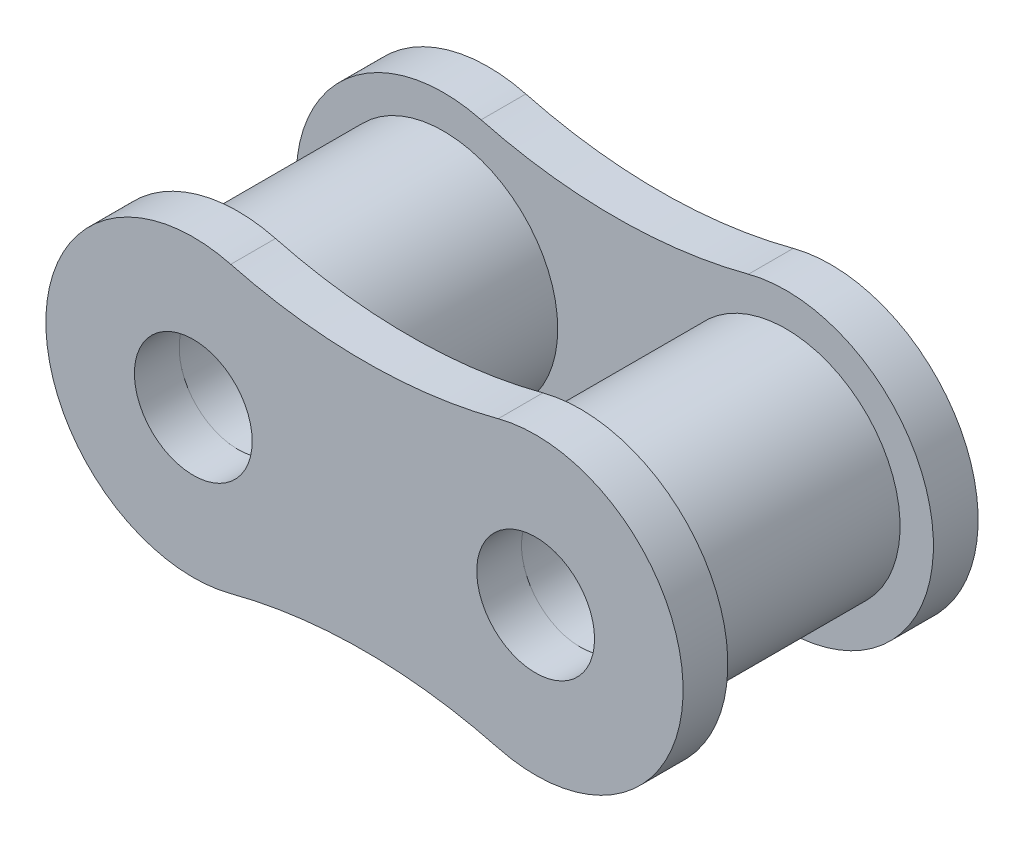
ISO-10303-21;
HEADER;
FILE_DESCRIPTION(('STEP AP214'),'2;1');
FILE_NAME('part.step','',(''),(''),'','','');
FILE_SCHEMA(('AUTOMOTIVE_DESIGN { 1 0 10303 214 1 1 1 1 }'));
ENDSEC;
DATA;
#1=APPLICATION_CONTEXT('core data for automotive mechanical design processes');
#2=APPLICATION_PROTOCOL_DEFINITION('international standard','automotive_design',2000,#1);
#3=PRODUCT_CONTEXT('',#1,'mechanical');
#4=PRODUCT('Part','Part','',(#3));
#5=PRODUCT_RELATED_PRODUCT_CATEGORY('part','',(#4));
#6=PRODUCT_DEFINITION_FORMATION('','',#4);
#7=PRODUCT_DEFINITION_CONTEXT('part definition',#1,'design');
#8=PRODUCT_DEFINITION('design','',#6,#7);
#9=PRODUCT_DEFINITION_SHAPE('','',#8);
#10=(LENGTH_UNIT() NAMED_UNIT(*) SI_UNIT(.MILLI.,.METRE.));
#11=(NAMED_UNIT(*) PLANE_ANGLE_UNIT() SI_UNIT($,.RADIAN.));
#12=(NAMED_UNIT(*) SI_UNIT($,.STERADIAN.) SOLID_ANGLE_UNIT());
#13=UNCERTAINTY_MEASURE_WITH_UNIT(LENGTH_MEASURE(1.E-05),#10,'distance_accuracy_value','');
#14=(GEOMETRIC_REPRESENTATION_CONTEXT(3) GLOBAL_UNCERTAINTY_ASSIGNED_CONTEXT((#13)) GLOBAL_UNIT_ASSIGNED_CONTEXT((#10,
#11,#12)) REPRESENTATION_CONTEXT('',''));
#15=CARTESIAN_POINT('',(0.,0.,0.));
#16=DIRECTION('',(0.,0.,1.));
#17=DIRECTION('',(1.,0.,0.));
#18=AXIS2_PLACEMENT_3D('',#15,#16,#17);
#19=CARTESIAN_POINT('',(2.38125,9.06153502708978,4.1046));
#20=DIRECTION('',(0.,0.,1.));
#21=DIRECTION('',(1.,0.,0.));
#22=AXIS2_PLACEMENT_3D('',#19,#20,#21);
#23=PLANE('',#22);
#24=CARTESIAN_POINT('',(-4.7625,0.,4.1046));
#25=DIRECTION('',(0.,0.,1.));
#26=DIRECTION('',(1.,0.,0.));
#27=AXIS2_PLACEMENT_3D('',#24,#25,#26);
#28=CIRCLE('',#27,1.6383);
#29=CARTESIAN_POINT('',(-3.1242,0.,4.1046));
#30=VERTEX_POINT('',#29);
#31=EDGE_CURVE('E113',#30,#30,#28,.T.);
#32=ORIENTED_EDGE('',*,*,#31,.F.);
#33=EDGE_LOOP('',(#32));
#34=FACE_BOUND('',#33,.T.);
#35=CARTESIAN_POINT('',(0.,18.1230700541796,4.1046));
#36=DIRECTION('',(0.,0.,-1.));
#37=DIRECTION('',(1.,0.,0.));
#38=AXIS2_PLACEMENT_3D('',#35,#36,#37);
#39=CIRCLE('',#38,14.6362850541796);
#40=CARTESIAN_POINT('',(3.71992075992603,3.96739876218244,4.1046));
#41=VERTEX_POINT('',#40);
#42=CARTESIAN_POINT('',(-3.71992075992603,3.96739876218244,4.1046));
#43=VERTEX_POINT('',#42);
#44=EDGE_CURVE('E98',#41,#43,#39,.T.);
#45=ORIENTED_EDGE('',*,*,#44,.T.);
#46=CARTESIAN_POINT('',(-4.7625,0.,4.1046));
#47=DIRECTION('',(0.,0.,1.));
#48=DIRECTION('',(1.,0.,0.));
#49=AXIS2_PLACEMENT_3D('',#46,#47,#48);
#50=CIRCLE('',#49,4.1021);
#51=CARTESIAN_POINT('',(-3.71992075992603,-3.96739876218244,4.1046));
#52=VERTEX_POINT('',#51);
#53=EDGE_CURVE('E93',#43,#52,#50,.T.);
#54=ORIENTED_EDGE('',*,*,#53,.T.);
#55=CARTESIAN_POINT('',(0.,-18.1230700541796,4.1046));
#56=DIRECTION('',(0.,0.,-1.));
#57=DIRECTION('',(1.,0.,0.));
#58=AXIS2_PLACEMENT_3D('',#55,#56,#57);
#59=CIRCLE('',#58,14.6362850541796);
#60=CARTESIAN_POINT('',(3.71992075992603,-3.96739876218244,4.1046));
#61=VERTEX_POINT('',#60);
#62=EDGE_CURVE('E96',#52,#61,#59,.T.);
#63=ORIENTED_EDGE('',*,*,#62,.T.);
#64=CARTESIAN_POINT('',(4.7625,0.,4.1046));
#65=DIRECTION('',(0.,0.,1.));
#66=DIRECTION('',(1.,0.,0.));
#67=AXIS2_PLACEMENT_3D('',#64,#65,#66);
#68=CIRCLE('',#67,4.1021);
#69=EDGE_CURVE('E63',#61,#41,#68,.T.);
#70=ORIENTED_EDGE('',*,*,#69,.T.);
#71=EDGE_LOOP('',(#45,#54,#63,#70));
#72=FACE_BOUND('',#71,.T.);
#73=CARTESIAN_POINT('',(4.7625,0.,4.1046));
#74=DIRECTION('',(0.,0.,1.));
#75=DIRECTION('',(1.,0.,0.));
#76=AXIS2_PLACEMENT_3D('',#73,#74,#75);
#77=CIRCLE('',#76,1.6383);
#78=CARTESIAN_POINT('',(6.4008,0.,4.1046));
#79=VERTEX_POINT('',#78);
#80=EDGE_CURVE('E128',#79,#79,#77,.T.);
#81=ORIENTED_EDGE('',*,*,#80,.F.);
#82=EDGE_LOOP('',(#81));
#83=FACE_BOUND('',#82,.T.);
#84=ADVANCED_FACE('F46',(#34,#72,#83),#23,.T.);
#85=CARTESIAN_POINT('',(2.38125,9.06153502708978,2.86));
#86=DIRECTION('',(0.,0.,1.));
#87=DIRECTION('',(1.,0.,0.));
#88=AXIS2_PLACEMENT_3D('',#85,#86,#87);
#89=PLANE('',#88);
#90=CARTESIAN_POINT('',(0.,18.1230700541796,2.86));
#91=DIRECTION('',(0.,0.,-1.));
#92=DIRECTION('',(1.,0.,0.));
#93=AXIS2_PLACEMENT_3D('',#90,#91,#92);
#94=CIRCLE('',#93,14.6362850541796);
#95=CARTESIAN_POINT('',(3.71992075992603,3.96739876218244,2.86));
#96=VERTEX_POINT('',#95);
#97=CARTESIAN_POINT('',(-3.71992075992603,3.96739876218244,2.86));
#98=VERTEX_POINT('',#97);
#99=EDGE_CURVE('E110',#96,#98,#94,.T.);
#100=ORIENTED_EDGE('',*,*,#99,.F.);
#101=CARTESIAN_POINT('',(4.7625,0.,2.86));
#102=DIRECTION('',(0.,0.,1.));
#103=DIRECTION('',(1.,0.,0.));
#104=AXIS2_PLACEMENT_3D('',#101,#102,#103);
#105=CIRCLE('',#104,4.1021);
#106=CARTESIAN_POINT('',(3.71992075992603,-3.96739876218244,2.86));
#107=VERTEX_POINT('',#106);
#108=EDGE_CURVE('E86',#107,#96,#105,.T.);
#109=ORIENTED_EDGE('',*,*,#108,.F.);
#110=CARTESIAN_POINT('',(0.,-18.1230700541796,2.86));
#111=DIRECTION('',(0.,0.,-1.));
#112=DIRECTION('',(1.,0.,0.));
#113=AXIS2_PLACEMENT_3D('',#110,#111,#112);
#114=CIRCLE('',#113,14.6362850541796);
#115=CARTESIAN_POINT('',(-3.71992075992603,-3.96739876218244,2.86));
#116=VERTEX_POINT('',#115);
#117=EDGE_CURVE('E80',#116,#107,#114,.T.);
#118=ORIENTED_EDGE('',*,*,#117,.F.);
#119=CARTESIAN_POINT('',(-4.7625,0.,2.86));
#120=DIRECTION('',(0.,0.,1.));
#121=DIRECTION('',(1.,0.,0.));
#122=AXIS2_PLACEMENT_3D('',#119,#120,#121);
#123=CIRCLE('',#122,4.1021);
#124=EDGE_CURVE('E102',#98,#116,#123,.T.);
#125=ORIENTED_EDGE('',*,*,#124,.F.);
#126=EDGE_LOOP('',(#100,#109,#118,#125));
#127=FACE_BOUND('',#126,.T.);
#128=CARTESIAN_POINT('',(-4.7625,0.,2.86));
#129=DIRECTION('',(0.,0.,1.));
#130=DIRECTION('',(1.,0.,0.));
#131=AXIS2_PLACEMENT_3D('',#128,#129,#130);
#132=CIRCLE('',#131,1.6383);
#133=CARTESIAN_POINT('',(-3.1242,0.,2.86));
#134=VERTEX_POINT('',#133);
#135=EDGE_CURVE('E125',#134,#134,#132,.T.);
#136=ORIENTED_EDGE('',*,*,#135,.T.);
#137=EDGE_LOOP('',(#136));
#138=FACE_BOUND('',#137,.T.);
#139=CARTESIAN_POINT('',(4.7625,0.,2.86));
#140=DIRECTION('',(0.,0.,1.));
#141=DIRECTION('',(1.,0.,0.));
#142=AXIS2_PLACEMENT_3D('',#139,#140,#141);
#143=CIRCLE('',#142,1.6383);
#144=CARTESIAN_POINT('',(6.4008,0.,2.86));
#145=VERTEX_POINT('',#144);
#146=EDGE_CURVE('E131',#145,#145,#143,.T.);
#147=ORIENTED_EDGE('',*,*,#146,.T.);
#148=EDGE_LOOP('',(#147));
#149=FACE_BOUND('',#148,.T.);
#150=ADVANCED_FACE('F121',(#127,#138,#149),#89,.F.);
#151=CARTESIAN_POINT('',(0.,18.1230700541796,4.1046));
#152=DIRECTION('',(0.,0.,-1.));
#153=DIRECTION('',(-1.,0.,0.));
#154=AXIS2_PLACEMENT_3D('',#151,#152,#153);
#155=CYLINDRICAL_SURFACE('',#154,14.6362850541796);
#156=ORIENTED_EDGE('',*,*,#99,.T.);
#157=DIRECTION('',(0.,0.,-1.));
#158=VECTOR('',#157,1.);
#159=CARTESIAN_POINT('',(-3.71992075992603,3.96739876218244,4.1046));
#160=LINE('',#159,#158);
#161=EDGE_CURVE('E12',#43,#98,#160,.T.);
#162=ORIENTED_EDGE('',*,*,#161,.F.);
#163=ORIENTED_EDGE('',*,*,#44,.F.);
#164=DIRECTION('',(0.,0.,-1.));
#165=VECTOR('',#164,1.);
#166=CARTESIAN_POINT('',(3.71992075992603,3.96739876218244,4.1046));
#167=LINE('',#166,#165);
#168=EDGE_CURVE('E106',#41,#96,#167,.T.);
#169=ORIENTED_EDGE('',*,*,#168,.T.);
#170=EDGE_LOOP('',(#156,#162,#163,#169));
#171=FACE_BOUND('',#170,.T.);
#172=ADVANCED_FACE('F48',(#171),#155,.F.);
#173=CARTESIAN_POINT('',(-4.7625,0.,4.1046));
#174=DIRECTION('',(0.,0.,-1.));
#175=DIRECTION('',(-1.,0.,0.));
#176=AXIS2_PLACEMENT_3D('',#173,#174,#175);
#177=CYLINDRICAL_SURFACE('',#176,4.1021);
#178=ORIENTED_EDGE('',*,*,#124,.T.);
#179=DIRECTION('',(0.,0.,-1.));
#180=VECTOR('',#179,1.);
#181=CARTESIAN_POINT('',(-3.71992075992603,-3.96739876218244,4.1046));
#182=LINE('',#181,#180);
#183=EDGE_CURVE('E55',#52,#116,#182,.T.);
#184=ORIENTED_EDGE('',*,*,#183,.F.);
#185=ORIENTED_EDGE('',*,*,#53,.F.);
#186=ORIENTED_EDGE('',*,*,#161,.T.);
#187=EDGE_LOOP('',(#178,#184,#185,#186));
#188=FACE_BOUND('',#187,.T.);
#189=ADVANCED_FACE('F101',(#188),#177,.T.);
#190=CARTESIAN_POINT('',(0.,-18.1230700541796,4.1046));
#191=DIRECTION('',(0.,0.,-1.));
#192=DIRECTION('',(-1.,0.,0.));
#193=AXIS2_PLACEMENT_3D('',#190,#191,#192);
#194=CYLINDRICAL_SURFACE('',#193,14.6362850541796);
#195=ORIENTED_EDGE('',*,*,#117,.T.);
#196=DIRECTION('',(0.,0.,-1.));
#197=VECTOR('',#196,1.);
#198=CARTESIAN_POINT('',(3.71992075992603,-3.96739876218244,4.1046));
#199=LINE('',#198,#197);
#200=EDGE_CURVE('E103',#61,#107,#199,.T.);
#201=ORIENTED_EDGE('',*,*,#200,.F.);
#202=ORIENTED_EDGE('',*,*,#62,.F.);
#203=ORIENTED_EDGE('',*,*,#183,.T.);
#204=EDGE_LOOP('',(#195,#201,#202,#203));
#205=FACE_BOUND('',#204,.T.);
#206=ADVANCED_FACE('F104',(#205),#194,.F.);
#207=CARTESIAN_POINT('',(4.7625,0.,4.1046));
#208=DIRECTION('',(0.,0.,-1.));
#209=DIRECTION('',(-1.,0.,0.));
#210=AXIS2_PLACEMENT_3D('',#207,#208,#209);
#211=CYLINDRICAL_SURFACE('',#210,4.1021);
#212=ORIENTED_EDGE('',*,*,#108,.T.);
#213=ORIENTED_EDGE('',*,*,#168,.F.);
#214=ORIENTED_EDGE('',*,*,#69,.F.);
#215=ORIENTED_EDGE('',*,*,#200,.T.);
#216=EDGE_LOOP('',(#212,#213,#214,#215));
#217=FACE_BOUND('',#216,.T.);
#218=ADVANCED_FACE('F118',(#217),#211,.T.);
#219=CARTESIAN_POINT('',(-4.7625,0.,4.1046));
#220=DIRECTION('',(0.,0.,-1.));
#221=DIRECTION('',(-1.,0.,0.));
#222=AXIS2_PLACEMENT_3D('',#219,#220,#221);
#223=CYLINDRICAL_SURFACE('',#222,1.6383);
#224=ORIENTED_EDGE('',*,*,#31,.T.);
#225=EDGE_LOOP('',(#224));
#226=FACE_BOUND('',#225,.T.);
#227=ORIENTED_EDGE('',*,*,#135,.F.);
#228=EDGE_LOOP('',(#227));
#229=FACE_BOUND('',#228,.T.);
#230=ADVANCED_FACE('F148',(#226,#229),#223,.F.);
#231=CARTESIAN_POINT('',(4.7625,0.,4.1046));
#232=DIRECTION('',(0.,0.,-1.));
#233=DIRECTION('',(-1.,0.,0.));
#234=AXIS2_PLACEMENT_3D('',#231,#232,#233);
#235=CYLINDRICAL_SURFACE('',#234,1.6383);
#236=ORIENTED_EDGE('',*,*,#80,.T.);
#237=EDGE_LOOP('',(#236));
#238=FACE_BOUND('',#237,.T.);
#239=ORIENTED_EDGE('',*,*,#146,.F.);
#240=EDGE_LOOP('',(#239));
#241=FACE_BOUND('',#240,.T.);
#242=ADVANCED_FACE('F137',(#238,#241),#235,.F.);
#243=CLOSED_SHELL('',(#84,#150,#172,#189,#206,#218,#230,#242));
#244=MANIFOLD_SOLID_BREP('B2',#243);
#245=CARTESIAN_POINT('',(2.38125,9.06153502708978,-2.86));
#246=DIRECTION('',(0.,0.,-1.));
#247=DIRECTION('',(1.,0.,0.));
#248=AXIS2_PLACEMENT_3D('',#245,#246,#247);
#249=PLANE('',#248);
#250=CARTESIAN_POINT('',(-4.7625,0.,-2.86));
#251=DIRECTION('',(0.,0.,1.));
#252=DIRECTION('',(1.,0.,0.));
#253=AXIS2_PLACEMENT_3D('',#250,#251,#252);
#254=CIRCLE('',#253,3.175);
#255=CARTESIAN_POINT('',(-1.5875,0.,-2.86));
#256=VERTEX_POINT('',#255);
#257=EDGE_CURVE('E302',#256,#256,#254,.T.);
#258=ORIENTED_EDGE('',*,*,#257,.F.);
#259=EDGE_LOOP('',(#258));
#260=FACE_BOUND('',#259,.T.);
#261=CARTESIAN_POINT('',(0.,18.1230700541796,-2.86));
#262=DIRECTION('',(0.,0.,-1.));
#263=DIRECTION('',(1.,0.,0.));
#264=AXIS2_PLACEMENT_3D('',#261,#262,#263);
#265=CIRCLE('',#264,14.6362850541796);
#266=CARTESIAN_POINT('',(3.71992075992603,3.96739876218244,-2.86));
#267=VERTEX_POINT('',#266);
#268=CARTESIAN_POINT('',(-3.71992075992603,3.96739876218244,-2.86));
#269=VERTEX_POINT('',#268);
#270=EDGE_CURVE('E284',#267,#269,#265,.T.);
#271=ORIENTED_EDGE('',*,*,#270,.T.);
#272=CARTESIAN_POINT('',(-4.7625,0.,-2.86));
#273=DIRECTION('',(0.,0.,1.));
#274=DIRECTION('',(1.,0.,0.));
#275=AXIS2_PLACEMENT_3D('',#272,#273,#274);
#276=CIRCLE('',#275,4.1021);
#277=CARTESIAN_POINT('',(-3.71992075992603,-3.96739876218244,-2.86));
#278=VERTEX_POINT('',#277);
#279=EDGE_CURVE('E255',#269,#278,#276,.T.);
#280=ORIENTED_EDGE('',*,*,#279,.T.);
#281=CARTESIAN_POINT('',(0.,-18.1230700541796,-2.86));
#282=DIRECTION('',(0.,0.,-1.));
#283=DIRECTION('',(1.,0.,0.));
#284=AXIS2_PLACEMENT_3D('',#281,#282,#283);
#285=CIRCLE('',#284,14.6362850541796);
#286=CARTESIAN_POINT('',(3.71992075992603,-3.96739876218244,-2.86));
#287=VERTEX_POINT('',#286);
#288=EDGE_CURVE('E289',#278,#287,#285,.T.);
#289=ORIENTED_EDGE('',*,*,#288,.T.);
#290=CARTESIAN_POINT('',(4.7625,0.,-2.86));
#291=DIRECTION('',(0.,0.,1.));
#292=DIRECTION('',(1.,0.,0.));
#293=AXIS2_PLACEMENT_3D('',#290,#291,#292);
#294=CIRCLE('',#293,4.1021);
#295=EDGE_CURVE('E286',#287,#267,#294,.T.);
#296=ORIENTED_EDGE('',*,*,#295,.T.);
#297=EDGE_LOOP('',(#271,#280,#289,#296));
#298=FACE_BOUND('',#297,.T.);
#299=CARTESIAN_POINT('',(4.7625,0.,-2.86));
#300=DIRECTION('',(0.,0.,-1.));
#301=DIRECTION('',(-1.,0.,0.));
#302=AXIS2_PLACEMENT_3D('',#299,#300,#301);
#303=CIRCLE('',#302,3.175);
#304=CARTESIAN_POINT('',(1.5875,0.,-2.86));
#305=VERTEX_POINT('',#304);
#306=EDGE_CURVE('E44',#305,#305,#303,.F.);
#307=ORIENTED_EDGE('',*,*,#306,.F.);
#308=EDGE_LOOP('',(#307));
#309=FACE_BOUND('',#308,.T.);
#310=ADVANCED_FACE('F211',(#260,#298,#309),#249,.F.);
#311=CARTESIAN_POINT('',(-4.7625,0.,2.86));
#312=DIRECTION('',(0.,0.,1.));
#313=DIRECTION('',(1.,0.,0.));
#314=AXIS2_PLACEMENT_3D('',#311,#312,#313);
#315=PLANE('',#314);
#316=CARTESIAN_POINT('',(-4.7625,0.,2.86));
#317=DIRECTION('',(0.,0.,1.));
#318=DIRECTION('',(1.,0.,0.));
#319=AXIS2_PLACEMENT_3D('',#316,#317,#318);
#320=CIRCLE('',#319,3.175);
#321=CARTESIAN_POINT('',(-1.5875,0.,2.86));
#322=VERTEX_POINT('',#321);
#323=EDGE_CURVE('E219',#322,#322,#320,.T.);
#324=ORIENTED_EDGE('',*,*,#323,.T.);
#325=EDGE_LOOP('',(#324));
#326=FACE_BOUND('',#325,.T.);
#327=CARTESIAN_POINT('',(-4.7625,0.,2.86));
#328=DIRECTION('',(0.,0.,1.));
#329=DIRECTION('',(1.,0.,0.));
#330=AXIS2_PLACEMENT_3D('',#327,#328,#329);
#331=CIRCLE('',#330,1.6637);
#332=CARTESIAN_POINT('',(-3.0988,0.,2.86));
#333=VERTEX_POINT('',#332);
#334=EDGE_CURVE('E303',#333,#333,#331,.T.);
#335=ORIENTED_EDGE('',*,*,#334,.F.);
#336=EDGE_LOOP('',(#335));
#337=FACE_BOUND('',#336,.T.);
#338=ADVANCED_FACE('F316',(#326,#337),#315,.T.);
#339=CARTESIAN_POINT('',(-4.7625,0.,2.86));
#340=DIRECTION('',(0.,0.,-1.));
#341=DIRECTION('',(-1.,0.,0.));
#342=AXIS2_PLACEMENT_3D('',#339,#340,#341);
#343=CYLINDRICAL_SURFACE('',#342,3.175);
#344=ORIENTED_EDGE('',*,*,#323,.F.);
#345=EDGE_LOOP('',(#344));
#346=FACE_BOUND('',#345,.T.);
#347=ORIENTED_EDGE('',*,*,#257,.T.);
#348=EDGE_LOOP('',(#347));
#349=FACE_BOUND('',#348,.T.);
#350=ADVANCED_FACE('F213',(#346,#349),#343,.T.);
#351=CARTESIAN_POINT('',(-4.7625,0.,2.86));
#352=DIRECTION('',(0.,0.,-1.));
#353=DIRECTION('',(-1.,0.,0.));
#354=AXIS2_PLACEMENT_3D('',#351,#352,#353);
#355=CYLINDRICAL_SURFACE('',#354,1.6637);
#356=ORIENTED_EDGE('',*,*,#334,.T.);
#357=EDGE_LOOP('',(#356));
#358=FACE_BOUND('',#357,.T.);
#359=CARTESIAN_POINT('',(-4.7625,0.,-2.86));
#360=DIRECTION('',(0.,0.,1.));
#361=DIRECTION('',(1.,0.,0.));
#362=AXIS2_PLACEMENT_3D('',#359,#360,#361);
#363=CIRCLE('',#362,1.6637);
#364=CARTESIAN_POINT('',(-3.0988,0.,-2.86));
#365=VERTEX_POINT('',#364);
#366=EDGE_CURVE('E306',#365,#365,#363,.T.);
#367=ORIENTED_EDGE('',*,*,#366,.F.);
#368=EDGE_LOOP('',(#367));
#369=FACE_BOUND('',#368,.T.);
#370=ADVANCED_FACE('F364',(#358,#369),#355,.F.);
#371=CARTESIAN_POINT('',(-4.7625,0.,-2.86));
#372=DIRECTION('',(0.,0.,1.));
#373=DIRECTION('',(1.,0.,0.));
#374=AXIS2_PLACEMENT_3D('',#371,#372,#373);
#375=CIRCLE('',#374,1.6383);
#376=CARTESIAN_POINT('',(-3.1242,0.,-2.86));
#377=VERTEX_POINT('',#376);
#378=EDGE_CURVE('E293',#377,#377,#375,.T.);
#379=ORIENTED_EDGE('',*,*,#378,.F.);
#380=EDGE_LOOP('',(#379));
#381=FACE_BOUND('',#380,.T.);
#382=ORIENTED_EDGE('',*,*,#366,.T.);
#383=EDGE_LOOP('',(#382));
#384=FACE_BOUND('',#383,.T.);
#385=ADVANCED_FACE('F318',(#381,#384),#249,.F.);
#386=CARTESIAN_POINT('',(2.38125,9.06153502708978,-4.1046));
#387=DIRECTION('',(0.,0.,-1.));
#388=DIRECTION('',(1.,0.,0.));
#389=AXIS2_PLACEMENT_3D('',#386,#387,#388);
#390=PLANE('',#389);
#391=CARTESIAN_POINT('',(-4.7625,0.,-4.1046));
#392=DIRECTION('',(0.,0.,1.));
#393=DIRECTION('',(1.,0.,0.));
#394=AXIS2_PLACEMENT_3D('',#391,#392,#393);
#395=CIRCLE('',#394,1.6383);
#396=CARTESIAN_POINT('',(-3.1242,0.,-4.1046));
#397=VERTEX_POINT('',#396);
#398=EDGE_CURVE('E271',#397,#397,#395,.T.);
#399=ORIENTED_EDGE('',*,*,#398,.T.);
#400=EDGE_LOOP('',(#399));
#401=FACE_BOUND('',#400,.T.);
#402=CARTESIAN_POINT('',(0.,18.1230700541796,-4.1046));
#403=DIRECTION('',(0.,0.,-1.));
#404=DIRECTION('',(1.,0.,0.));
#405=AXIS2_PLACEMENT_3D('',#402,#403,#404);
#406=CIRCLE('',#405,14.6362850541796);
#407=CARTESIAN_POINT('',(3.71992075992603,3.96739876218244,-4.1046));
#408=VERTEX_POINT('',#407);
#409=CARTESIAN_POINT('',(-3.71992075992603,3.96739876218244,-4.1046));
#410=VERTEX_POINT('',#409);
#411=EDGE_CURVE('E265',#408,#410,#406,.T.);
#412=ORIENTED_EDGE('',*,*,#411,.F.);
#413=CARTESIAN_POINT('',(4.7625,0.,-4.1046));
#414=DIRECTION('',(0.,0.,1.));
#415=DIRECTION('',(1.,0.,0.));
#416=AXIS2_PLACEMENT_3D('',#413,#414,#415);
#417=CIRCLE('',#416,4.1021);
#418=CARTESIAN_POINT('',(3.71992075992603,-3.96739876218244,-4.1046));
#419=VERTEX_POINT('',#418);
#420=EDGE_CURVE('E279',#419,#408,#417,.T.);
#421=ORIENTED_EDGE('',*,*,#420,.F.);
#422=CARTESIAN_POINT('',(0.,-18.1230700541796,-4.1046));
#423=DIRECTION('',(0.,0.,-1.));
#424=DIRECTION('',(1.,0.,0.));
#425=AXIS2_PLACEMENT_3D('',#422,#423,#424);
#426=CIRCLE('',#425,14.6362850541796);
#427=CARTESIAN_POINT('',(-3.71992075992603,-3.96739876218244,-4.1046));
#428=VERTEX_POINT('',#427);
#429=EDGE_CURVE('E267',#428,#419,#426,.T.);
#430=ORIENTED_EDGE('',*,*,#429,.F.);
#431=CARTESIAN_POINT('',(-4.7625,0.,-4.1046));
#432=DIRECTION('',(0.,0.,1.));
#433=DIRECTION('',(1.,0.,0.));
#434=AXIS2_PLACEMENT_3D('',#431,#432,#433);
#435=CIRCLE('',#434,4.1021);
#436=EDGE_CURVE('E252',#410,#428,#435,.T.);
#437=ORIENTED_EDGE('',*,*,#436,.F.);
#438=EDGE_LOOP('',(#412,#421,#430,#437));
#439=FACE_BOUND('',#438,.T.);
#440=CARTESIAN_POINT('',(4.7625,0.,-4.1046));
#441=DIRECTION('',(0.,0.,1.));
#442=DIRECTION('',(1.,0.,0.));
#443=AXIS2_PLACEMENT_3D('',#440,#441,#442);
#444=CIRCLE('',#443,1.6383);
#445=CARTESIAN_POINT('',(6.4008,0.,-4.1046));
#446=VERTEX_POINT('',#445);
#447=EDGE_CURVE('E281',#446,#446,#444,.T.);
#448=ORIENTED_EDGE('',*,*,#447,.T.);
#449=EDGE_LOOP('',(#448));
#450=FACE_BOUND('',#449,.T.);
#451=ADVANCED_FACE('F262',(#401,#439,#450),#390,.T.);
#452=CARTESIAN_POINT('',(4.7625,0.,-2.86));
#453=DIRECTION('',(0.,0.,1.));
#454=DIRECTION('',(1.,0.,0.));
#455=AXIS2_PLACEMENT_3D('',#452,#453,#454);
#456=CIRCLE('',#455,1.6637);
#457=CARTESIAN_POINT('',(6.4262,0.,-2.86));
#458=VERTEX_POINT('',#457);
#459=EDGE_CURVE('E483',#458,#458,#456,.T.);
#460=ORIENTED_EDGE('',*,*,#459,.T.);
#461=EDGE_LOOP('',(#460));
#462=FACE_BOUND('',#461,.T.);
#463=CARTESIAN_POINT('',(4.7625,0.,-2.86));
#464=DIRECTION('',(0.,0.,1.));
#465=DIRECTION('',(1.,0.,0.));
#466=AXIS2_PLACEMENT_3D('',#463,#464,#465);
#467=CIRCLE('',#466,1.6383);
#468=CARTESIAN_POINT('',(6.4008,0.,-2.86));
#469=VERTEX_POINT('',#468);
#470=EDGE_CURVE('E258',#469,#469,#467,.T.);
#471=ORIENTED_EDGE('',*,*,#470,.F.);
#472=EDGE_LOOP('',(#471));
#473=FACE_BOUND('',#472,.T.);
#474=ADVANCED_FACE('F319',(#462,#473),#249,.F.);
#475=CARTESIAN_POINT('',(0.,18.1230700541796,-4.1046));
#476=DIRECTION('',(0.,0.,1.));
#477=DIRECTION('',(-1.,0.,0.));
#478=AXIS2_PLACEMENT_3D('',#475,#476,#477);
#479=CYLINDRICAL_SURFACE('',#478,14.6362850541796);
#480=ORIENTED_EDGE('',*,*,#270,.F.);
#481=DIRECTION('',(0.,0.,1.));
#482=VECTOR('',#481,1.);
#483=CARTESIAN_POINT('',(3.71992075992603,3.96739876218244,-4.1046));
#484=LINE('',#483,#482);
#485=EDGE_CURVE('E257',#408,#267,#484,.T.);
#486=ORIENTED_EDGE('',*,*,#485,.F.);
#487=ORIENTED_EDGE('',*,*,#411,.T.);
#488=DIRECTION('',(0.,0.,1.));
#489=VECTOR('',#488,1.);
#490=CARTESIAN_POINT('',(-3.71992075992603,3.96739876218244,-4.1046));
#491=LINE('',#490,#489);
#492=EDGE_CURVE('E226',#410,#269,#491,.T.);
#493=ORIENTED_EDGE('',*,*,#492,.T.);
#494=EDGE_LOOP('',(#480,#486,#487,#493));
#495=FACE_BOUND('',#494,.T.);
#496=ADVANCED_FACE('F269',(#495),#479,.F.);
#497=CARTESIAN_POINT('',(-4.7625,0.,-4.1046));
#498=DIRECTION('',(0.,0.,1.));
#499=DIRECTION('',(-1.,0.,0.));
#500=AXIS2_PLACEMENT_3D('',#497,#498,#499);
#501=CYLINDRICAL_SURFACE('',#500,4.1021);
#502=ORIENTED_EDGE('',*,*,#279,.F.);
#503=ORIENTED_EDGE('',*,*,#492,.F.);
#504=ORIENTED_EDGE('',*,*,#436,.T.);
#505=DIRECTION('',(0.,0.,1.));
#506=VECTOR('',#505,1.);
#507=CARTESIAN_POINT('',(-3.71992075992603,-3.96739876218244,-4.1046));
#508=LINE('',#507,#506);
#509=EDGE_CURVE('E233',#428,#278,#508,.T.);
#510=ORIENTED_EDGE('',*,*,#509,.T.);
#511=EDGE_LOOP('',(#502,#503,#504,#510));
#512=FACE_BOUND('',#511,.T.);
#513=ADVANCED_FACE('F251',(#512),#501,.T.);
#514=CARTESIAN_POINT('',(0.,-18.1230700541796,-4.1046));
#515=DIRECTION('',(0.,0.,1.));
#516=DIRECTION('',(-1.,0.,0.));
#517=AXIS2_PLACEMENT_3D('',#514,#515,#516);
#518=CYLINDRICAL_SURFACE('',#517,14.6362850541796);
#519=ORIENTED_EDGE('',*,*,#288,.F.);
#520=ORIENTED_EDGE('',*,*,#509,.F.);
#521=ORIENTED_EDGE('',*,*,#429,.T.);
#522=DIRECTION('',(0.,0.,1.));
#523=VECTOR('',#522,1.);
#524=CARTESIAN_POINT('',(3.71992075992603,-3.96739876218244,-4.1046));
#525=LINE('',#524,#523);
#526=EDGE_CURVE('E300',#419,#287,#525,.T.);
#527=ORIENTED_EDGE('',*,*,#526,.T.);
#528=EDGE_LOOP('',(#519,#520,#521,#527));
#529=FACE_BOUND('',#528,.T.);
#530=ADVANCED_FACE('F349',(#529),#518,.F.);
#531=CARTESIAN_POINT('',(4.7625,0.,-4.1046));
#532=DIRECTION('',(0.,0.,1.));
#533=DIRECTION('',(-1.,0.,0.));
#534=AXIS2_PLACEMENT_3D('',#531,#532,#533);
#535=CYLINDRICAL_SURFACE('',#534,4.1021);
#536=ORIENTED_EDGE('',*,*,#295,.F.);
#537=ORIENTED_EDGE('',*,*,#526,.F.);
#538=ORIENTED_EDGE('',*,*,#420,.T.);
#539=ORIENTED_EDGE('',*,*,#485,.T.);
#540=EDGE_LOOP('',(#536,#537,#538,#539));
#541=FACE_BOUND('',#540,.T.);
#542=ADVANCED_FACE('F352',(#541),#535,.T.);
#543=CARTESIAN_POINT('',(-4.7625,0.,-4.1046));
#544=DIRECTION('',(0.,0.,1.));
#545=DIRECTION('',(-1.,0.,0.));
#546=AXIS2_PLACEMENT_3D('',#543,#544,#545);
#547=CYLINDRICAL_SURFACE('',#546,1.6383);
#548=ORIENTED_EDGE('',*,*,#398,.F.);
#549=EDGE_LOOP('',(#548));
#550=FACE_BOUND('',#549,.T.);
#551=ORIENTED_EDGE('',*,*,#378,.T.);
#552=EDGE_LOOP('',(#551));
#553=FACE_BOUND('',#552,.T.);
#554=ADVANCED_FACE('F356',(#550,#553),#547,.F.);
#555=CARTESIAN_POINT('',(4.7625,0.,-4.1046));
#556=DIRECTION('',(0.,0.,1.));
#557=DIRECTION('',(-1.,0.,0.));
#558=AXIS2_PLACEMENT_3D('',#555,#556,#557);
#559=CYLINDRICAL_SURFACE('',#558,1.6383);
#560=ORIENTED_EDGE('',*,*,#447,.F.);
#561=EDGE_LOOP('',(#560));
#562=FACE_BOUND('',#561,.T.);
#563=ORIENTED_EDGE('',*,*,#470,.T.);
#564=EDGE_LOOP('',(#563));
#565=FACE_BOUND('',#564,.T.);
#566=ADVANCED_FACE('F335',(#562,#565),#559,.F.);
#567=CARTESIAN_POINT('',(4.7625,0.,2.86));
#568=DIRECTION('',(0.,0.,1.));
#569=DIRECTION('',(1.,0.,0.));
#570=AXIS2_PLACEMENT_3D('',#567,#568,#569);
#571=PLANE('',#570);
#572=CARTESIAN_POINT('',(4.7625,0.,2.86));
#573=DIRECTION('',(0.,0.,1.));
#574=DIRECTION('',(1.,0.,0.));
#575=AXIS2_PLACEMENT_3D('',#572,#573,#574);
#576=CIRCLE('',#575,3.175);
#577=CARTESIAN_POINT('',(7.9375,0.,2.86));
#578=VERTEX_POINT('',#577);
#579=EDGE_CURVE('E274',#578,#578,#576,.T.);
#580=ORIENTED_EDGE('',*,*,#579,.T.);
#581=EDGE_LOOP('',(#580));
#582=FACE_BOUND('',#581,.T.);
#583=CARTESIAN_POINT('',(4.7625,0.,2.86));
#584=DIRECTION('',(0.,0.,1.));
#585=DIRECTION('',(1.,0.,0.));
#586=AXIS2_PLACEMENT_3D('',#583,#584,#585);
#587=CIRCLE('',#586,1.6637);
#588=CARTESIAN_POINT('',(6.4262,0.,2.86));
#589=VERTEX_POINT('',#588);
#590=EDGE_CURVE('E485',#589,#589,#587,.T.);
#591=ORIENTED_EDGE('',*,*,#590,.F.);
#592=EDGE_LOOP('',(#591));
#593=FACE_BOUND('',#592,.T.);
#594=ADVANCED_FACE('F326',(#582,#593),#571,.T.);
#595=CARTESIAN_POINT('',(4.7625,0.,2.86));
#596=DIRECTION('',(0.,0.,-1.));
#597=DIRECTION('',(-1.,0.,0.));
#598=AXIS2_PLACEMENT_3D('',#595,#596,#597);
#599=CYLINDRICAL_SURFACE('',#598,3.175);
#600=ORIENTED_EDGE('',*,*,#579,.F.);
#601=EDGE_LOOP('',(#600));
#602=FACE_BOUND('',#601,.T.);
#603=ORIENTED_EDGE('',*,*,#306,.T.);
#604=EDGE_LOOP('',(#603));
#605=FACE_BOUND('',#604,.T.);
#606=ADVANCED_FACE('F323',(#602,#605),#599,.T.);
#607=CARTESIAN_POINT('',(4.7625,0.,2.86));
#608=DIRECTION('',(0.,0.,-1.));
#609=DIRECTION('',(-1.,0.,0.));
#610=AXIS2_PLACEMENT_3D('',#607,#608,#609);
#611=CYLINDRICAL_SURFACE('',#610,1.6637);
#612=ORIENTED_EDGE('',*,*,#590,.T.);
#613=EDGE_LOOP('',(#612));
#614=FACE_BOUND('',#613,.T.);
#615=ORIENTED_EDGE('',*,*,#459,.F.);
#616=EDGE_LOOP('',(#615));
#617=FACE_BOUND('',#616,.T.);
#618=ADVANCED_FACE('F325',(#614,#617),#611,.F.);
#619=CLOSED_SHELL('',(#310,#338,#350,#370,#385,#451,#474,#496,#513,#530,#542,#554,#566,#594,
#606,#618));
#620=MANIFOLD_SOLID_BREP('B6',#619);
#621=ADVANCED_BREP_SHAPE_REPRESENTATION('',(#18,#244,#620),#14);
#622=SHAPE_DEFINITION_REPRESENTATION(#9,#621);
ENDSEC;
END-ISO-10303-21;
